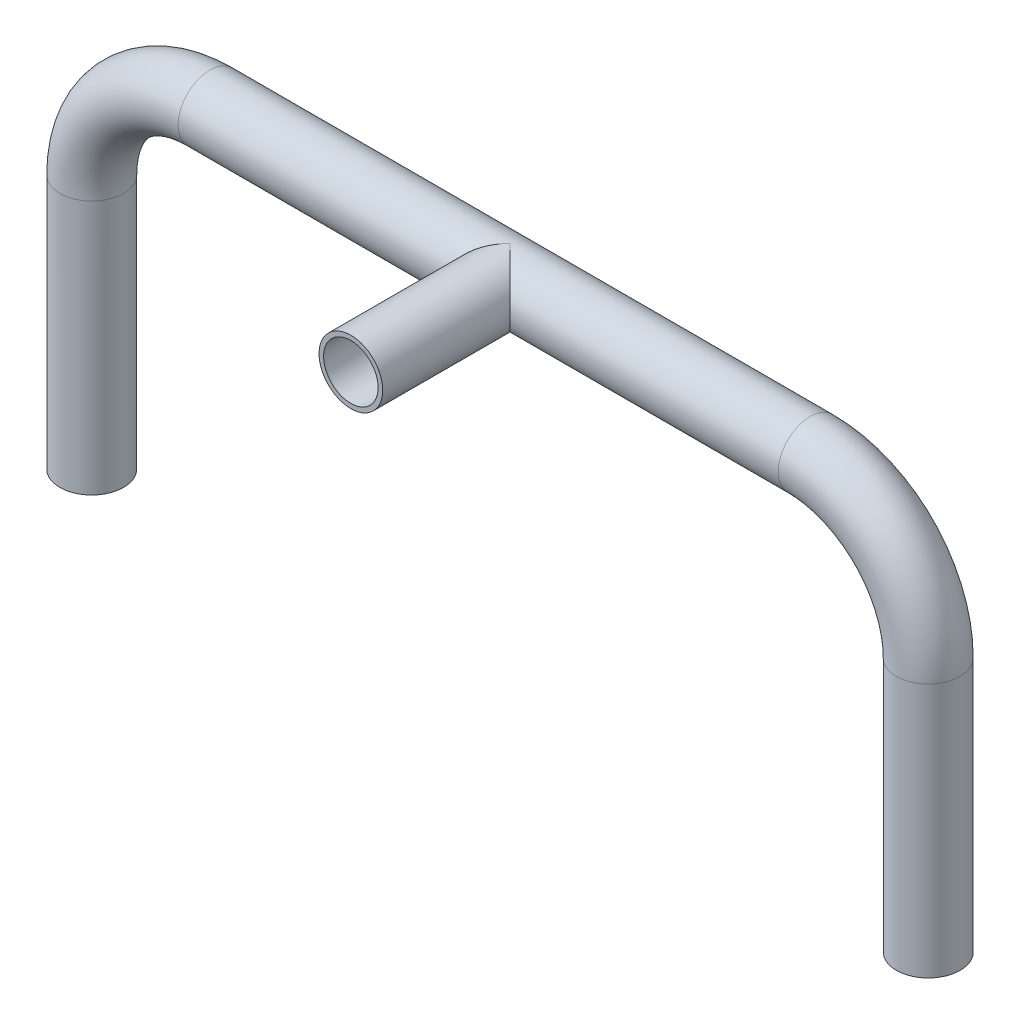
ISO-10303-21;
HEADER;
FILE_DESCRIPTION(('STEP AP214'),'2;1');
FILE_NAME('part.step','',(''),(''),'','','');
FILE_SCHEMA(('AUTOMOTIVE_DESIGN { 1 0 10303 214 1 1 1 1 }'));
ENDSEC;
DATA;
#1=APPLICATION_CONTEXT('core data for automotive mechanical design processes');
#2=APPLICATION_PROTOCOL_DEFINITION('international standard','automotive_design',2000,#1);
#3=PRODUCT_CONTEXT('',#1,'mechanical');
#4=PRODUCT('Part','Part','',(#3));
#5=PRODUCT_RELATED_PRODUCT_CATEGORY('part','',(#4));
#6=PRODUCT_DEFINITION_FORMATION('','',#4);
#7=PRODUCT_DEFINITION_CONTEXT('part definition',#1,'design');
#8=PRODUCT_DEFINITION('design','',#6,#7);
#9=PRODUCT_DEFINITION_SHAPE('','',#8);
#10=(LENGTH_UNIT() NAMED_UNIT(*) SI_UNIT(.MILLI.,.METRE.));
#11=(NAMED_UNIT(*) PLANE_ANGLE_UNIT() SI_UNIT($,.RADIAN.));
#12=(NAMED_UNIT(*) SI_UNIT($,.STERADIAN.) SOLID_ANGLE_UNIT());
#13=UNCERTAINTY_MEASURE_WITH_UNIT(LENGTH_MEASURE(1.E-05),#10,'distance_accuracy_value','');
#14=(GEOMETRIC_REPRESENTATION_CONTEXT(3) GLOBAL_UNCERTAINTY_ASSIGNED_CONTEXT((#13)) GLOBAL_UNIT_ASSIGNED_CONTEXT((#10,
#11,#12)) REPRESENTATION_CONTEXT('',''));
#15=CARTESIAN_POINT('',(0.,0.,0.));
#16=DIRECTION('',(0.,0.,1.));
#17=DIRECTION('',(1.,0.,0.));
#18=AXIS2_PLACEMENT_3D('',#15,#16,#17);
#19=CARTESIAN_POINT('',(-33.,0.,0.));
#20=DIRECTION('',(1.,0.,0.));
#21=DIRECTION('',(0.,0.,-1.));
#22=AXIS2_PLACEMENT_3D('',#19,#20,#21);
#23=CYLINDRICAL_SURFACE('',#22,3.5);
#24=CARTESIAN_POINT('',(-33.,0.,0.));
#25=DIRECTION('',(-1.,0.,0.));
#26=DIRECTION('',(0.,-1.,0.));
#27=AXIS2_PLACEMENT_3D('',#24,#25,#26);
#28=CIRCLE('',#27,3.5);
#29=CARTESIAN_POINT('',(-33.,3.50000000000001,0.));
#30=VERTEX_POINT('',#29);
#31=EDGE_CURVE('E290',#30,#30,#28,.T.);
#32=ORIENTED_EDGE('',*,*,#31,.F.);
#33=EDGE_LOOP('',(#32));
#34=FACE_BOUND('',#33,.T.);
#35=CARTESIAN_POINT('',(33.,0.,0.));
#36=DIRECTION('',(1.,0.,0.));
#37=DIRECTION('',(0.,0.,-1.));
#38=AXIS2_PLACEMENT_3D('',#35,#36,#37);
#39=CIRCLE('',#38,3.5);
#40=CARTESIAN_POINT('',(33.,3.5,0.));
#41=VERTEX_POINT('',#40);
#42=EDGE_CURVE('E293',#41,#41,#39,.F.);
#43=ORIENTED_EDGE('',*,*,#42,.T.);
#44=EDGE_LOOP('',(#43));
#45=FACE_BOUND('',#44,.T.);
#46=CARTESIAN_POINT('',(0.,0.,0.));
#47=DIRECTION('',(0.707106781186547,0.,-0.707106781186547));
#48=DIRECTION('',(0.707106781186547,0.,0.707106781186547));
#49=AXIS2_PLACEMENT_3D('',#46,#47,#48);
#50=ELLIPSE('',#49,4.94974746830583,3.5);
#51=CARTESIAN_POINT('',(0.,-3.5,0.));
#52=VERTEX_POINT('',#51);
#53=CARTESIAN_POINT('',(0.,3.5,0.));
#54=VERTEX_POINT('',#53);
#55=EDGE_CURVE('E270',#52,#54,#50,.F.);
#56=ORIENTED_EDGE('',*,*,#55,.F.);
#57=CARTESIAN_POINT('',(0.,0.,0.));
#58=DIRECTION('',(0.707106781186547,0.,0.707106781186547));
#59=DIRECTION('',(0.707106781186547,0.,-0.707106781186547));
#60=AXIS2_PLACEMENT_3D('',#57,#58,#59);
#61=ELLIPSE('',#60,4.94974746830583,3.5);
#62=EDGE_CURVE('E73',#54,#52,#61,.T.);
#63=ORIENTED_EDGE('',*,*,#62,.F.);
#64=EDGE_LOOP('',(#56,#63));
#65=FACE_BOUND('',#64,.T.);
#66=ADVANCED_FACE('F51',(#34,#45,#65),#23,.T.);
#67=CARTESIAN_POINT('',(-33.,0.,0.));
#68=DIRECTION('',(1.,0.,0.));
#69=DIRECTION('',(0.,0.,-1.));
#70=AXIS2_PLACEMENT_3D('',#67,#68,#69);
#71=CYLINDRICAL_SURFACE('',#70,2.5);
#72=CARTESIAN_POINT('',(33.,0.,0.));
#73=DIRECTION('',(-1.,0.,0.));
#74=DIRECTION('',(0.,0.,1.));
#75=AXIS2_PLACEMENT_3D('',#72,#73,#74);
#76=CIRCLE('',#75,2.5);
#77=CARTESIAN_POINT('',(33.,2.50000000000001,0.));
#78=VERTEX_POINT('',#77);
#79=EDGE_CURVE('E277',#78,#78,#76,.T.);
#80=ORIENTED_EDGE('',*,*,#79,.F.);
#81=EDGE_LOOP('',(#80));
#82=FACE_BOUND('',#81,.T.);
#83=CARTESIAN_POINT('',(-33.,0.,0.));
#84=DIRECTION('',(-1.,0.,0.));
#85=DIRECTION('',(0.,0.,1.));
#86=AXIS2_PLACEMENT_3D('',#83,#84,#85);
#87=CIRCLE('',#86,2.5);
#88=CARTESIAN_POINT('',(-33.,2.50000000000001,0.));
#89=VERTEX_POINT('',#88);
#90=EDGE_CURVE('E272',#89,#89,#87,.T.);
#91=ORIENTED_EDGE('',*,*,#90,.T.);
#92=EDGE_LOOP('',(#91));
#93=FACE_BOUND('',#92,.T.);
#94=DIRECTION('',(1.,0.,0.));
#95=VECTOR('',#94,1.);
#96=CARTESIAN_POINT('',(-33.,-2.5,0.));
#97=LINE('',#96,#95);
#98=CARTESIAN_POINT('',(1.6583123951777,-2.5,0.));
#99=VERTEX_POINT('',#98);
#100=CARTESIAN_POINT('',(2.44948974278318,-2.5,0.));
#101=VERTEX_POINT('',#100);
#102=EDGE_CURVE('E115',#99,#101,#97,.T.);
#103=ORIENTED_EDGE('',*,*,#102,.T.);
#104=CARTESIAN_POINT('',(2.44948974278318,-2.5,0.));
#105=CARTESIAN_POINT('',(2.44944907007493,-2.50001766916298,0.0600526131090836));
#106=CARTESIAN_POINT('',(2.45169710608634,-2.49783705343878,0.120078538718097));
#107=CARTESIAN_POINT('',(2.46045447286871,-2.48922287861778,0.239411831935812));
#108=CARTESIAN_POINT('',(2.46695651852141,-2.48279659017782,0.298720251762426));
#109=CARTESIAN_POINT('',(2.48381067013746,-2.4659309717882,0.415489668269687));
#110=CARTESIAN_POINT('',(2.4941178190541,-2.45553845595176,0.472964045082401));
#111=CARTESIAN_POINT('',(2.51808842320246,-2.43095196214054,0.586380750717431));
#112=CARTESIAN_POINT('',(2.53175316691415,-2.41675652460194,0.642322482203759));
#113=CARTESIAN_POINT('',(2.57674977279544,-2.36902031603926,0.806649858466303));
#114=CARTESIAN_POINT('',(2.61222461544596,-2.33019832933539,0.912408855743075));
#115=CARTESIAN_POINT('',(2.6900487116162,-2.23991081543498,1.11591626245835));
#116=CARTESIAN_POINT('',(2.73242051841456,-2.1884035133721,1.21363675184487));
#117=CARTESIAN_POINT('',(2.82841871138342,-2.06332979756339,1.41755313391703));
#118=CARTESIAN_POINT('',(2.88268691420757,-1.98745241980949,1.52203529336443));
#119=CARTESIAN_POINT('',(2.99093180837159,-1.82051332960056,1.7182419914403));
#120=CARTESIAN_POINT('',(3.04490832329947,-1.72944330314019,1.80995949406843));
#121=CARTESIAN_POINT('',(3.15774584045157,-1.51515925705173,1.99438810896048));
#122=CARTESIAN_POINT('',(3.21577997770527,-1.3891088861523,2.08440081172775));
#123=CARTESIAN_POINT('',(3.29352132961311,-1.18658007367669,2.20184535916877));
#124=CARTESIAN_POINT('',(3.31787937131514,-1.11684416664416,2.23805874980852));
#125=CARTESIAN_POINT('',(3.36279506251625,-0.973272843117625,2.30412254199296));
#126=CARTESIAN_POINT('',(3.38335446180146,-0.89943933460438,2.33397587417549));
#127=CARTESIAN_POINT('',(3.42807218479089,-0.714756756551895,2.39842395424957));
#128=CARTESIAN_POINT('',(3.44980679699365,-0.601967089787534,2.42928530574772));
#129=CARTESIAN_POINT('',(3.48214445038761,-0.371712488694297,2.47499324407442));
#130=CARTESIAN_POINT('',(3.49275678546049,-0.254251543066919,2.48985320210661));
#131=CARTESIAN_POINT('',(3.50195985332979,-0.0176660311068557,2.50274740907398));
#132=CARTESIAN_POINT('',(3.50052501373577,0.101461537941369,2.50074586627733));
#133=CARTESIAN_POINT('',(3.48569885764395,0.337487235790802,2.47994926387458));
#134=CARTESIAN_POINT('',(3.47230430171367,0.454384751792909,2.46114965430978));
#135=CARTESIAN_POINT('',(3.43521868843221,0.679693842686157,2.40853968512004));
#136=CARTESIAN_POINT('',(3.41180417221796,0.788246980526544,2.37513198975248));
#137=CARTESIAN_POINT('',(3.35647173923039,0.997933635349307,2.29493854645672));
#138=CARTESIAN_POINT('',(3.32455215929594,1.09906569620507,2.24815018181375));
#139=CARTESIAN_POINT('',(3.25030690752976,1.30329977157233,2.1369145128044));
#140=CARTESIAN_POINT('',(3.20721772475739,1.40536373678751,2.07107978090016));
#141=CARTESIAN_POINT('',(3.11594100830245,1.59757876713174,1.92671165465687));
#142=CARTESIAN_POINT('',(3.06774837883014,1.68771771930596,1.84816552587169));
#143=CARTESIAN_POINT('',(2.96024186440912,1.87088432223528,1.66421791662331));
#144=CARTESIAN_POINT('',(2.90051509403557,1.96138344425109,1.55653487673368));
#145=CARTESIAN_POINT('',(2.78381372303776,2.12376109306031,1.32644866613006));
#146=CARTESIAN_POINT('',(2.72683980244734,2.195635037833,1.20404188401982));
#147=CARTESIAN_POINT('',(2.63458354593604,2.30497117802467,0.974393734409701));
#148=CARTESIAN_POINT('',(2.5973029424587,2.34653634273485,0.869916995821651));
#149=CARTESIAN_POINT('',(2.53312697280473,2.41567834883303,0.653668202702087));
#150=CARTESIAN_POINT('',(2.50618928953307,2.44331233691497,0.541928110038003));
#151=CARTESIAN_POINT('',(2.47453980812302,2.47526879942077,0.357851902224224));
#152=CARTESIAN_POINT('',(2.46525754353572,2.48447904684907,0.287128025528568));
#153=CARTESIAN_POINT('',(2.45268214722051,2.49687304891357,0.144301856093983));
#154=CARTESIAN_POINT('',(2.44941717898643,2.50002846720513,0.0721946695301675));
#155=CARTESIAN_POINT('',(2.44948974278318,2.5,0.));
#156=B_SPLINE_CURVE_WITH_KNOTS('',3,(#104,#105,#106,#107,#108,#109,#110,#111,#112,#113,#114,
#115,#116,#117,#118,#119,#120,#121,#122,#123,#124,#125,#126,#127,#128,#129,#130,#131,#132,#133,
#134,#135,#136,#137,#138,#139,#140,#141,#142,#143,#144,#145,#146,#147,#148,#149,#150,#151,#152,
#153,#154,#155),.UNSPECIFIED.,.F.,.F.,(4,2,2,2,2,2,2,2,2,2,2,2,2,2,2,2,2,2,2,2,2,2,2,2,2,4),(0.,
0.180033338148606,0.359759168024823,0.537426174398067,0.71516146741717,1.06799013172764,
1.4219966319152,1.84068465468142,2.25960255589019,2.75268038127791,2.99911677559095,
3.24543936821249,3.60060053650129,3.95546469150787,4.31108230244934,4.66679626591251,
5.01326887007376,5.35980927657376,5.74499567351802,6.13057037166115,6.58719647137415,
7.04393480025761,7.39813615393726,7.75087247830245,7.96615901563481,8.18245065080504),.UNSPECIFIED.);
#157=CARTESIAN_POINT('',(2.44948974278318,2.5,0.));
#158=VERTEX_POINT('',#157);
#159=EDGE_CURVE('E110',#101,#158,#156,.T.);
#160=ORIENTED_EDGE('',*,*,#159,.T.);
#161=DIRECTION('',(1.,0.,0.));
#162=VECTOR('',#161,1.);
#163=CARTESIAN_POINT('',(-33.,2.5,0.));
#164=LINE('',#163,#162);
#165=CARTESIAN_POINT('',(1.6583123951777,2.5,0.));
#166=VERTEX_POINT('',#165);
#167=EDGE_CURVE('E103',#158,#166,#164,.F.);
#168=ORIENTED_EDGE('',*,*,#167,.T.);
#169=CARTESIAN_POINT('',(1.6583123951777,-2.5,0.));
#170=CARTESIAN_POINT('',(1.65828023930748,-2.50001053689097,0.0446676190961172));
#171=CARTESIAN_POINT('',(1.6601162772629,-2.4988033626358,0.0893146756582218));
#172=CARTESIAN_POINT('',(1.66727317263236,-2.49403945424107,0.178118808574985));
#173=CARTESIAN_POINT('',(1.67258731179569,-2.49048724961453,0.222276662984987));
#174=CARTESIAN_POINT('',(1.68634898291668,-2.48118723003889,0.309186552805186));
#175=CARTESIAN_POINT('',(1.69474943169533,-2.47547237004126,0.351949707497475));
#176=CARTESIAN_POINT('',(1.71430901873712,-2.46196831278083,0.436516845554949));
#177=CARTESIAN_POINT('',(1.72546968412582,-2.4541779670438,0.478320283905698));
#178=CARTESIAN_POINT('',(1.77222694334976,-2.42094569151119,0.634726425048234));
#179=CARTESIAN_POINT('',(1.81578246635463,-2.38888265367656,0.745590990119837));
#180=CARTESIAN_POINT('',(1.91309058631365,-2.3117030535744,0.958667215286052));
#181=CARTESIAN_POINT('',(1.96692669689499,-2.26647787223489,1.06079733200858));
#182=CARTESIAN_POINT('',(2.06333806009315,-2.17845139252837,1.22908717969094));
#183=CARTESIAN_POINT('',(2.10487744088078,-2.13847839662809,1.2973472734266));
#184=CARTESIAN_POINT('',(2.18877312173695,-2.05253160808426,1.42945216003762));
#185=CARTESIAN_POINT('',(2.23112976012052,-2.00655528279991,1.49329507193548));
#186=CARTESIAN_POINT('',(2.3573792706994,-1.85992335660289,1.67790046606017));
#187=CARTESIAN_POINT('',(2.44073385868859,-1.75032166679402,1.79220223726546));
#188=CARTESIAN_POINT('',(2.5810766365136,-1.53332316028445,1.9785848485795));
#189=CARTESIAN_POINT('',(2.63991085386501,-1.43037180448632,2.05448117836856));
#190=CARTESIAN_POINT('',(2.74774689794262,-1.21029935284124,2.19132333858638));
#191=CARTESIAN_POINT('',(2.79676246687922,-1.09319843428571,2.25229009148164));
#192=CARTESIAN_POINT('',(2.87372981565162,-0.867928883305877,2.3471135832324));
#193=CARTESIAN_POINT('',(2.90385830152503,-0.761717046456606,2.38383517864742));
#194=CARTESIAN_POINT('',(2.95260444248338,-0.542830448073848,2.44298114981978));
#195=CARTESIAN_POINT('',(2.9712291086228,-0.43015966882419,2.46541423403497));
#196=CARTESIAN_POINT('',(2.99549159829453,-0.200906226670692,2.49460149180071));
#197=CARTESIAN_POINT('',(3.00107488681869,-0.0843091977674743,2.50128982658614));
#198=CARTESIAN_POINT('',(2.99858143920542,0.148527340090233,2.49829775944192));
#199=CARTESIAN_POINT('',(2.99050499932994,0.264766856743924,2.48861771252144));
#200=CARTESIAN_POINT('',(2.96241339443721,0.485445759029511,2.45478579221322));
#201=CARTESIAN_POINT('',(2.94323604357123,0.590153469719584,2.43164900062191));
#202=CARTESIAN_POINT('',(2.89501327215416,0.793625750717623,2.37305235039454));
#203=CARTESIAN_POINT('',(2.86596638567855,0.892389435591339,2.3375906611205));
#204=CARTESIAN_POINT('',(2.79690287446883,1.09053416369652,2.25240860554024));
#205=CARTESIAN_POINT('',(2.7561602110168,1.18924473934221,2.20172771983302));
#206=CARTESIAN_POINT('',(2.66744714285834,1.3767800718126,2.08960269254213));
#207=CARTESIAN_POINT('',(2.61947031903863,1.46559592577916,2.02814898391748));
#208=CARTESIAN_POINT('',(2.49448801107939,1.67280362441445,1.86454080960494));
#209=CARTESIAN_POINT('',(2.41452810108692,1.78517382835748,1.75692904106797));
#210=CARTESIAN_POINT('',(2.29203972156859,1.93670155603639,1.58276013263235));
#211=CARTESIAN_POINT('',(2.25072647403067,1.98442714978062,1.5224861962744));
#212=CARTESIAN_POINT('',(2.16828385513607,2.07418686478911,1.39772822879842));
#213=CARTESIAN_POINT('',(2.12715442261523,2.11622304065682,1.33324573004271));
#214=CARTESIAN_POINT('',(2.02736668216148,2.21282190384309,1.16889290959051));
#215=CARTESIAN_POINT('',(1.96949413582953,2.26406445132992,1.06656162182183));
#216=CARTESIAN_POINT('',(1.86215058777702,2.35313154217164,0.852162280933767));
#217=CARTESIAN_POINT('',(1.81265778441366,2.39099119237604,0.740120677710074));
#218=CARTESIAN_POINT('',(1.7431252104005,2.44187928159532,0.54236812349213));
#219=CARTESIAN_POINT('',(1.71871174214238,2.45896760338397,0.459278569532454));
#220=CARTESIAN_POINT('',(1.68136078058062,2.48466533863309,0.289382777852357));
#221=CARTESIAN_POINT('',(1.66838023493806,2.49330657445815,0.20259178487256));
#222=CARTESIAN_POINT('',(1.66098011654761,2.49822814088172,0.0960725270432542));
#223=CARTESIAN_POINT('',(1.65998140373825,2.49889195042314,0.0768814878014975));
#224=CARTESIAN_POINT('',(1.65864846758547,2.49977745262101,0.0384623376736734));
#225=CARTESIAN_POINT('',(1.65831437598636,2.49999905762165,0.0192342201937478));
#226=CARTESIAN_POINT('',(1.6583123951777,2.5,0.));
#227=B_SPLINE_CURVE_WITH_KNOTS('',3,(#169,#170,#171,#172,#173,#174,#175,#176,#177,#178,#179,
#180,#181,#182,#183,#184,#185,#186,#187,#188,#189,#190,#191,#192,#193,#194,#195,#196,#197,#198,
#199,#200,#201,#202,#203,#204,#205,#206,#207,#208,#209,#210,#211,#212,#213,#214,#215,#216,#217,
#218,#219,#220,#221,#222,#223,#224,#225,#226),.UNSPECIFIED.,.F.,.F.,(4,2,2,2,2,2,2,2,2,2,2,2,2,
2,2,2,2,2,2,2,2,2,2,2,2,2,2,2,4),(0.,0.133915809511517,0.267573709534375,0.399271959248702,
0.531043236367035,0.898867426511474,1.26981755381915,1.53753000139769,1.8053557566704,
2.33924592067388,2.76010881123972,3.18037848070633,3.52797653415751,3.87536253284724,
4.22419861170398,4.57302712485181,4.89843954153485,5.22390031294721,5.57721326116425,
5.93084158108767,6.45264424433968,6.71427180911986,6.97580463953597,7.35949670871462,
7.74217465007992,8.00607441227289,8.26897611958204,8.32665105551863,8.38433742291034),.UNSPECIFIED.);
#228=EDGE_CURVE('E104',#99,#166,#227,.T.);
#229=ORIENTED_EDGE('',*,*,#228,.F.);
#230=EDGE_LOOP('',(#103,#160,#168,#229));
#231=FACE_BOUND('',#230,.T.);
#232=CARTESIAN_POINT('',(-1.6583123951777,2.5,0.));
#233=VERTEX_POINT('',#232);
#234=CARTESIAN_POINT('',(-2.44948974278318,2.5,0.));
#235=VERTEX_POINT('',#234);
#236=EDGE_CURVE('E112',#233,#235,#164,.F.);
#237=ORIENTED_EDGE('',*,*,#236,.T.);
#238=CARTESIAN_POINT('',(-2.44948974278318,2.5,0.));
#239=CARTESIAN_POINT('',(-2.44944907007493,2.50001766916298,0.0600526131090836));
#240=CARTESIAN_POINT('',(-2.45169710608634,2.49783705343878,0.120078538718097));
#241=CARTESIAN_POINT('',(-2.46045447286871,2.48922287861778,0.239411831935812));
#242=CARTESIAN_POINT('',(-2.46695651852141,2.48279659017782,0.298720251762426));
#243=CARTESIAN_POINT('',(-2.48381067013746,2.4659309717882,0.415489668269687));
#244=CARTESIAN_POINT('',(-2.4941178190541,2.45553845595176,0.472964045082401));
#245=CARTESIAN_POINT('',(-2.51808842320246,2.43095196214054,0.586380750717431));
#246=CARTESIAN_POINT('',(-2.53175316691415,2.41675652460194,0.642322482203759));
#247=CARTESIAN_POINT('',(-2.57674977279544,2.36902031603926,0.806649858466303));
#248=CARTESIAN_POINT('',(-2.61222461544596,2.33019832933539,0.912408855743075));
#249=CARTESIAN_POINT('',(-2.6900487116162,2.23991081543498,1.11591626245835));
#250=CARTESIAN_POINT('',(-2.73242051841456,2.1884035133721,1.21363675184487));
#251=CARTESIAN_POINT('',(-2.82841871138342,2.06332979756339,1.41755313391703));
#252=CARTESIAN_POINT('',(-2.88268691420757,1.98745241980949,1.52203529336443));
#253=CARTESIAN_POINT('',(-2.99093180837159,1.82051332960056,1.7182419914403));
#254=CARTESIAN_POINT('',(-3.04490832329947,1.72944330314019,1.80995949406843));
#255=CARTESIAN_POINT('',(-3.15774584045157,1.51515925705173,1.99438810896048));
#256=CARTESIAN_POINT('',(-3.21577997770527,1.3891088861523,2.08440081172775));
#257=CARTESIAN_POINT('',(-3.29352132961311,1.18658007367669,2.20184535916877));
#258=CARTESIAN_POINT('',(-3.31787937131514,1.11684416664416,2.23805874980852));
#259=CARTESIAN_POINT('',(-3.36279506251625,0.973272843117625,2.30412254199296));
#260=CARTESIAN_POINT('',(-3.38335446180146,0.89943933460438,2.33397587417549));
#261=CARTESIAN_POINT('',(-3.42807218479089,0.714756756551895,2.39842395424957));
#262=CARTESIAN_POINT('',(-3.44980679699365,0.601967089787534,2.42928530574772));
#263=CARTESIAN_POINT('',(-3.48214445038761,0.371712488694297,2.47499324407442));
#264=CARTESIAN_POINT('',(-3.49275678546049,0.254251543066919,2.48985320210661));
#265=CARTESIAN_POINT('',(-3.50195985332979,0.0176660311068557,2.50274740907398));
#266=CARTESIAN_POINT('',(-3.50052501373577,-0.101461537941369,2.50074586627733));
#267=CARTESIAN_POINT('',(-3.48569885764395,-0.337487235790802,2.47994926387458));
#268=CARTESIAN_POINT('',(-3.47230430171367,-0.454384751792909,2.46114965430978));
#269=CARTESIAN_POINT('',(-3.43521868843221,-0.679693842686157,2.40853968512004));
#270=CARTESIAN_POINT('',(-3.41180417221796,-0.788246980526544,2.37513198975248));
#271=CARTESIAN_POINT('',(-3.35647173923039,-0.997933635349307,2.29493854645672));
#272=CARTESIAN_POINT('',(-3.32455215929594,-1.09906569620507,2.24815018181375));
#273=CARTESIAN_POINT('',(-3.25030690752976,-1.30329977157233,2.1369145128044));
#274=CARTESIAN_POINT('',(-3.20721772475739,-1.40536373678751,2.07107978090016));
#275=CARTESIAN_POINT('',(-3.11594100830245,-1.59757876713174,1.92671165465687));
#276=CARTESIAN_POINT('',(-3.06774837883014,-1.68771771930596,1.84816552587169));
#277=CARTESIAN_POINT('',(-2.96024186440912,-1.87088432223528,1.66421791662331));
#278=CARTESIAN_POINT('',(-2.90051509403557,-1.96138344425109,1.55653487673368));
#279=CARTESIAN_POINT('',(-2.78381372303776,-2.12376109306031,1.32644866613006));
#280=CARTESIAN_POINT('',(-2.72683980244734,-2.195635037833,1.20404188401982));
#281=CARTESIAN_POINT('',(-2.63458354593604,-2.30497117802467,0.974393734409701));
#282=CARTESIAN_POINT('',(-2.5973029424587,-2.34653634273485,0.869916995821651));
#283=CARTESIAN_POINT('',(-2.53312697280473,-2.41567834883303,0.653668202702087));
#284=CARTESIAN_POINT('',(-2.50618928953307,-2.44331233691497,0.541928110038003));
#285=CARTESIAN_POINT('',(-2.47453980812302,-2.47526879942077,0.357851902224224));
#286=CARTESIAN_POINT('',(-2.46525754353572,-2.48447904684907,0.287128025528568));
#287=CARTESIAN_POINT('',(-2.45268214722051,-2.49687304891357,0.144301856093983));
#288=CARTESIAN_POINT('',(-2.44941717898643,-2.50002846720513,0.0721946695301675));
#289=CARTESIAN_POINT('',(-2.44948974278318,-2.5,0.));
#290=B_SPLINE_CURVE_WITH_KNOTS('',3,(#238,#239,#240,#241,#242,#243,#244,#245,#246,#247,#248,
#249,#250,#251,#252,#253,#254,#255,#256,#257,#258,#259,#260,#261,#262,#263,#264,#265,#266,#267,
#268,#269,#270,#271,#272,#273,#274,#275,#276,#277,#278,#279,#280,#281,#282,#283,#284,#285,#286,
#287,#288,#289),.UNSPECIFIED.,.F.,.F.,(4,2,2,2,2,2,2,2,2,2,2,2,2,2,2,2,2,2,2,2,2,2,2,2,2,4),(0.,
0.180033338148606,0.359759168024823,0.537426174398067,0.71516146741717,1.06799013172764,
1.4219966319152,1.84068465468142,2.25960255589019,2.75268038127791,2.99911677559095,
3.24543936821249,3.60060053650129,3.95546469150787,4.31108230244934,4.66679626591251,
5.01326887007376,5.35980927657376,5.74499567351802,6.13057037166115,6.58719647137415,
7.04393480025761,7.39813615393726,7.75087247830245,7.96615901563481,8.18245065080504),.UNSPECIFIED.);
#291=CARTESIAN_POINT('',(-2.44948974278318,-2.5,0.));
#292=VERTEX_POINT('',#291);
#293=EDGE_CURVE('E12',#235,#292,#290,.T.);
#294=ORIENTED_EDGE('',*,*,#293,.T.);
#295=CARTESIAN_POINT('',(-1.6583123951777,-2.5,0.));
#296=VERTEX_POINT('',#295);
#297=EDGE_CURVE('E63',#292,#296,#97,.T.);
#298=ORIENTED_EDGE('',*,*,#297,.T.);
#299=CARTESIAN_POINT('',(-1.6583123951777,2.5,0.));
#300=CARTESIAN_POINT('',(-1.65828023930748,2.50001053689097,0.0446676190961172));
#301=CARTESIAN_POINT('',(-1.6601162772629,2.4988033626358,0.0893146756582218));
#302=CARTESIAN_POINT('',(-1.66727317263236,2.49403945424107,0.178118808574985));
#303=CARTESIAN_POINT('',(-1.67258731179569,2.49048724961453,0.222276662984987));
#304=CARTESIAN_POINT('',(-1.68634898291668,2.48118723003889,0.309186552805186));
#305=CARTESIAN_POINT('',(-1.69474943169533,2.47547237004126,0.351949707497475));
#306=CARTESIAN_POINT('',(-1.71430901873712,2.46196831278083,0.436516845554949));
#307=CARTESIAN_POINT('',(-1.72546968412582,2.4541779670438,0.478320283905698));
#308=CARTESIAN_POINT('',(-1.77222694334976,2.42094569151119,0.634726425048234));
#309=CARTESIAN_POINT('',(-1.81578246635463,2.38888265367656,0.745590990119837));
#310=CARTESIAN_POINT('',(-1.91309058631365,2.3117030535744,0.958667215286052));
#311=CARTESIAN_POINT('',(-1.96692669689499,2.26647787223489,1.06079733200858));
#312=CARTESIAN_POINT('',(-2.06333806009315,2.17845139252837,1.22908717969094));
#313=CARTESIAN_POINT('',(-2.10487744088078,2.13847839662809,1.2973472734266));
#314=CARTESIAN_POINT('',(-2.18877312173695,2.05253160808426,1.42945216003762));
#315=CARTESIAN_POINT('',(-2.23112976012052,2.00655528279991,1.49329507193548));
#316=CARTESIAN_POINT('',(-2.3573792706994,1.85992335660289,1.67790046606017));
#317=CARTESIAN_POINT('',(-2.44073385868859,1.75032166679402,1.79220223726546));
#318=CARTESIAN_POINT('',(-2.5810766365136,1.53332316028445,1.9785848485795));
#319=CARTESIAN_POINT('',(-2.63991085386501,1.43037180448632,2.05448117836856));
#320=CARTESIAN_POINT('',(-2.74774689794262,1.21029935284124,2.19132333858638));
#321=CARTESIAN_POINT('',(-2.79676246687922,1.09319843428571,2.25229009148164));
#322=CARTESIAN_POINT('',(-2.87372981565162,0.867928883305877,2.3471135832324));
#323=CARTESIAN_POINT('',(-2.90385830152503,0.761717046456606,2.38383517864742));
#324=CARTESIAN_POINT('',(-2.95260444248338,0.542830448073848,2.44298114981978));
#325=CARTESIAN_POINT('',(-2.9712291086228,0.43015966882419,2.46541423403497));
#326=CARTESIAN_POINT('',(-2.99549159829453,0.200906226670692,2.49460149180071));
#327=CARTESIAN_POINT('',(-3.00107488681869,0.0843091977674743,2.50128982658614));
#328=CARTESIAN_POINT('',(-2.99858143920542,-0.148527340090233,2.49829775944192));
#329=CARTESIAN_POINT('',(-2.99050499932994,-0.264766856743924,2.48861771252144));
#330=CARTESIAN_POINT('',(-2.96241339443721,-0.485445759029511,2.45478579221322));
#331=CARTESIAN_POINT('',(-2.94323604357123,-0.590153469719584,2.43164900062191));
#332=CARTESIAN_POINT('',(-2.89501327215416,-0.793625750717623,2.37305235039454));
#333=CARTESIAN_POINT('',(-2.86596638567855,-0.892389435591339,2.3375906611205));
#334=CARTESIAN_POINT('',(-2.79690287446883,-1.09053416369652,2.25240860554024));
#335=CARTESIAN_POINT('',(-2.7561602110168,-1.18924473934221,2.20172771983302));
#336=CARTESIAN_POINT('',(-2.66744714285834,-1.3767800718126,2.08960269254213));
#337=CARTESIAN_POINT('',(-2.61947031903863,-1.46559592577916,2.02814898391748));
#338=CARTESIAN_POINT('',(-2.49448801107939,-1.67280362441445,1.86454080960494));
#339=CARTESIAN_POINT('',(-2.41452810108692,-1.78517382835748,1.75692904106797));
#340=CARTESIAN_POINT('',(-2.29203972156859,-1.93670155603639,1.58276013263235));
#341=CARTESIAN_POINT('',(-2.25072647403067,-1.98442714978062,1.5224861962744));
#342=CARTESIAN_POINT('',(-2.16828385513607,-2.07418686478911,1.39772822879842));
#343=CARTESIAN_POINT('',(-2.12715442261523,-2.11622304065682,1.33324573004271));
#344=CARTESIAN_POINT('',(-2.02736668216148,-2.21282190384309,1.16889290959051));
#345=CARTESIAN_POINT('',(-1.96949413582953,-2.26406445132992,1.06656162182183));
#346=CARTESIAN_POINT('',(-1.86215058777702,-2.35313154217164,0.852162280933767));
#347=CARTESIAN_POINT('',(-1.81265778441366,-2.39099119237604,0.740120677710074));
#348=CARTESIAN_POINT('',(-1.7431252104005,-2.44187928159532,0.54236812349213));
#349=CARTESIAN_POINT('',(-1.71871174214238,-2.45896760338397,0.459278569532454));
#350=CARTESIAN_POINT('',(-1.68136078058062,-2.48466533863309,0.289382777852357));
#351=CARTESIAN_POINT('',(-1.66838023493806,-2.49330657445815,0.20259178487256));
#352=CARTESIAN_POINT('',(-1.66098011654761,-2.49822814088172,0.0960725270432542));
#353=CARTESIAN_POINT('',(-1.65998140373825,-2.49889195042314,0.0768814878014975));
#354=CARTESIAN_POINT('',(-1.65864846758547,-2.49977745262101,0.0384623376736734));
#355=CARTESIAN_POINT('',(-1.65831437598636,-2.49999905762165,0.0192342201937478));
#356=CARTESIAN_POINT('',(-1.6583123951777,-2.5,0.));
#357=B_SPLINE_CURVE_WITH_KNOTS('',3,(#299,#300,#301,#302,#303,#304,#305,#306,#307,#308,#309,
#310,#311,#312,#313,#314,#315,#316,#317,#318,#319,#320,#321,#322,#323,#324,#325,#326,#327,#328,
#329,#330,#331,#332,#333,#334,#335,#336,#337,#338,#339,#340,#341,#342,#343,#344,#345,#346,#347,
#348,#349,#350,#351,#352,#353,#354,#355,#356),.UNSPECIFIED.,.F.,.F.,(4,2,2,2,2,2,2,2,2,2,2,2,2,
2,2,2,2,2,2,2,2,2,2,2,2,2,2,2,4),(0.,0.133915809511517,0.267573709534375,0.399271959248702,
0.531043236367035,0.898867426511474,1.26981755381915,1.53753000139769,1.8053557566704,
2.33924592067388,2.76010881123972,3.18037848070633,3.52797653415751,3.87536253284724,
4.22419861170398,4.57302712485181,4.89843954153485,5.22390031294721,5.57721326116425,
5.93084158108767,6.45264424433968,6.71427180911986,6.97580463953597,7.35949670871462,
7.74217465007992,8.00607441227289,8.26897611958204,8.32665105551863,8.38433742291034),.UNSPECIFIED.);
#358=EDGE_CURVE('E163',#233,#296,#357,.T.);
#359=ORIENTED_EDGE('',*,*,#358,.F.);
#360=EDGE_LOOP('',(#237,#294,#298,#359));
#361=FACE_BOUND('',#360,.T.);
#362=ADVANCED_FACE('F101',(#82,#93,#231,#361),#71,.F.);
#363=CARTESIAN_POINT('',(-46.,-41.,0.));
#364=DIRECTION('',(0.,-1.,0.));
#365=DIRECTION('',(0.,0.,1.));
#366=AXIS2_PLACEMENT_3D('',#363,#364,#365);
#367=PLANE('',#366);
#368=CARTESIAN_POINT('',(-46.,-41.,0.));
#369=DIRECTION('',(0.,-1.,0.));
#370=DIRECTION('',(0.,0.,1.));
#371=AXIS2_PLACEMENT_3D('',#368,#369,#370);
#372=CIRCLE('',#371,2.5);
#373=CARTESIAN_POINT('',(-46.,-41.,2.5));
#374=VERTEX_POINT('',#373);
#375=EDGE_CURVE('E267',#374,#374,#372,.T.);
#376=ORIENTED_EDGE('',*,*,#375,.F.);
#377=EDGE_LOOP('',(#376));
#378=FACE_BOUND('',#377,.T.);
#379=CARTESIAN_POINT('',(-46.,-41.,0.));
#380=DIRECTION('',(0.,-1.,0.));
#381=DIRECTION('',(1.,0.,0.));
#382=AXIS2_PLACEMENT_3D('',#379,#380,#381);
#383=CIRCLE('',#382,3.5);
#384=CARTESIAN_POINT('',(-42.5,-41.,0.));
#385=VERTEX_POINT('',#384);
#386=EDGE_CURVE('E284',#385,#385,#383,.T.);
#387=ORIENTED_EDGE('',*,*,#386,.T.);
#388=EDGE_LOOP('',(#387));
#389=FACE_BOUND('',#388,.T.);
#390=ADVANCED_FACE('F180',(#378,#389),#367,.T.);
#391=CARTESIAN_POINT('',(46.,-41.,0.));
#392=DIRECTION('',(0.,1.,0.));
#393=DIRECTION('',(0.,0.,1.));
#394=AXIS2_PLACEMENT_3D('',#391,#392,#393);
#395=PLANE('',#394);
#396=CARTESIAN_POINT('',(46.,-41.,0.));
#397=DIRECTION('',(0.,1.,0.));
#398=DIRECTION('',(0.,0.,1.));
#399=AXIS2_PLACEMENT_3D('',#396,#397,#398);
#400=CIRCLE('',#399,2.5);
#401=CARTESIAN_POINT('',(46.,-41.,2.5));
#402=VERTEX_POINT('',#401);
#403=EDGE_CURVE('E285',#402,#402,#400,.T.);
#404=ORIENTED_EDGE('',*,*,#403,.T.);
#405=EDGE_LOOP('',(#404));
#406=FACE_BOUND('',#405,.T.);
#407=CARTESIAN_POINT('',(46.,-41.,0.));
#408=DIRECTION('',(0.,1.,0.));
#409=DIRECTION('',(0.,0.,1.));
#410=AXIS2_PLACEMENT_3D('',#407,#408,#409);
#411=CIRCLE('',#410,3.5);
#412=CARTESIAN_POINT('',(46.,-41.,3.5));
#413=VERTEX_POINT('',#412);
#414=EDGE_CURVE('E118',#413,#413,#411,.T.);
#415=ORIENTED_EDGE('',*,*,#414,.F.);
#416=EDGE_LOOP('',(#415));
#417=FACE_BOUND('',#416,.T.);
#418=ADVANCED_FACE('F195',(#406,#417),#395,.F.);
#419=CARTESIAN_POINT('',(-46.,-41.,0.));
#420=DIRECTION('',(0.,1.,0.));
#421=DIRECTION('',(-1.,0.,0.));
#422=AXIS2_PLACEMENT_3D('',#419,#420,#421);
#423=CYLINDRICAL_SURFACE('',#422,3.5);
#424=CARTESIAN_POINT('',(-46.,-13.,0.));
#425=DIRECTION('',(0.,1.,0.));
#426=DIRECTION('',(-1.,0.,0.));
#427=AXIS2_PLACEMENT_3D('',#424,#425,#426);
#428=CIRCLE('',#427,3.5);
#429=CARTESIAN_POINT('',(-49.5,-13.,0.));
#430=VERTEX_POINT('',#429);
#431=EDGE_CURVE('E288',#430,#430,#428,.F.);
#432=ORIENTED_EDGE('',*,*,#431,.T.);
#433=EDGE_LOOP('',(#432));
#434=FACE_BOUND('',#433,.T.);
#435=ORIENTED_EDGE('',*,*,#386,.F.);
#436=EDGE_LOOP('',(#435));
#437=FACE_BOUND('',#436,.T.);
#438=ADVANCED_FACE('F193',(#434,#437),#423,.T.);
#439=CARTESIAN_POINT('',(-33.,-13.,0.));
#440=DIRECTION('',(0.,0.,-1.));
#441=DIRECTION('',(-1.,0.,0.));
#442=AXIS2_PLACEMENT_3D('',#439,#440,#441);
#443=TOROIDAL_SURFACE('',#442,13.,3.5);
#444=CARTESIAN_POINT('',(-33.,-13.,0.));
#445=DIRECTION('',(0.,0.,-1.));
#446=DIRECTION('',(-1.,0.,0.));
#447=AXIS2_PLACEMENT_3D('',#444,#445,#446);
#448=CIRCLE('',#447,16.5);
#449=EDGE_CURVE('',#430,#30,#448,.T.);
#450=ORIENTED_EDGE('',*,*,#431,.F.);
#451=ORIENTED_EDGE('',*,*,#31,.T.);
#452=ORIENTED_EDGE('',*,*,#449,.T.);
#453=ORIENTED_EDGE('',*,*,#449,.F.);
#454=EDGE_LOOP('',(#450,#452,#451,#453));
#455=FACE_BOUND('',#454,.T.);
#456=ADVANCED_FACE('F203',(#455),#443,.T.);
#457=CARTESIAN_POINT('',(33.,-13.,0.));
#458=DIRECTION('',(0.,0.,-1.));
#459=DIRECTION('',(-1.,0.,0.));
#460=AXIS2_PLACEMENT_3D('',#457,#458,#459);
#461=TOROIDAL_SURFACE('',#460,13.,3.5);
#462=CARTESIAN_POINT('',(46.,-13.,0.));
#463=DIRECTION('',(0.,1.,0.));
#464=DIRECTION('',(-1.,0.,0.));
#465=AXIS2_PLACEMENT_3D('',#462,#463,#464);
#466=CIRCLE('',#465,3.5);
#467=CARTESIAN_POINT('',(49.5,-13.,0.));
#468=VERTEX_POINT('',#467);
#469=EDGE_CURVE('E295',#468,#468,#466,.T.);
#470=CARTESIAN_POINT('',(33.,-13.,0.));
#471=DIRECTION('',(0.,0.,-1.));
#472=DIRECTION('',(-1.,0.,0.));
#473=AXIS2_PLACEMENT_3D('',#470,#471,#472);
#474=CIRCLE('',#473,16.5);
#475=EDGE_CURVE('',#41,#468,#474,.T.);
#476=ORIENTED_EDGE('',*,*,#42,.F.);
#477=ORIENTED_EDGE('',*,*,#469,.T.);
#478=ORIENTED_EDGE('',*,*,#475,.T.);
#479=ORIENTED_EDGE('',*,*,#475,.F.);
#480=EDGE_LOOP('',(#476,#478,#477,#479));
#481=FACE_BOUND('',#480,.T.);
#482=ADVANCED_FACE('F205',(#481),#461,.T.);
#483=CARTESIAN_POINT('',(46.,-13.,0.));
#484=DIRECTION('',(0.,-1.,0.));
#485=DIRECTION('',(1.,0.,0.));
#486=AXIS2_PLACEMENT_3D('',#483,#484,#485);
#487=CYLINDRICAL_SURFACE('',#486,3.5);
#488=ORIENTED_EDGE('',*,*,#414,.T.);
#489=EDGE_LOOP('',(#488));
#490=FACE_BOUND('',#489,.T.);
#491=ORIENTED_EDGE('',*,*,#469,.F.);
#492=EDGE_LOOP('',(#491));
#493=FACE_BOUND('',#492,.T.);
#494=ADVANCED_FACE('F52',(#490,#493),#487,.T.);
#495=CARTESIAN_POINT('',(-46.,-41.,0.));
#496=DIRECTION('',(0.,1.,0.));
#497=DIRECTION('',(-1.,0.,0.));
#498=AXIS2_PLACEMENT_3D('',#495,#496,#497);
#499=CYLINDRICAL_SURFACE('',#498,2.5);
#500=CARTESIAN_POINT('',(-46.,-13.,0.));
#501=DIRECTION('',(0.,-1.,0.));
#502=DIRECTION('',(0.,0.,1.));
#503=AXIS2_PLACEMENT_3D('',#500,#501,#502);
#504=CIRCLE('',#503,2.5);
#505=CARTESIAN_POINT('',(-48.5,-13.,0.));
#506=VERTEX_POINT('',#505);
#507=EDGE_CURVE('E264',#506,#506,#504,.T.);
#508=ORIENTED_EDGE('',*,*,#507,.F.);
#509=EDGE_LOOP('',(#508));
#510=FACE_BOUND('',#509,.T.);
#511=ORIENTED_EDGE('',*,*,#375,.T.);
#512=EDGE_LOOP('',(#511));
#513=FACE_BOUND('',#512,.T.);
#514=ADVANCED_FACE('F249',(#510,#513),#499,.F.);
#515=CARTESIAN_POINT('',(-33.,-13.,0.));
#516=DIRECTION('',(0.,0.,-1.));
#517=DIRECTION('',(-1.,0.,0.));
#518=AXIS2_PLACEMENT_3D('',#515,#516,#517);
#519=TOROIDAL_SURFACE('',#518,13.,2.5);
#520=CARTESIAN_POINT('',(-33.,-13.,0.));
#521=DIRECTION('',(0.,0.,-1.));
#522=DIRECTION('',(-1.,0.,0.));
#523=AXIS2_PLACEMENT_3D('',#520,#521,#522);
#524=CIRCLE('',#523,15.5);
#525=EDGE_CURVE('',#506,#89,#524,.T.);
#526=ORIENTED_EDGE('',*,*,#507,.T.);
#527=ORIENTED_EDGE('',*,*,#90,.F.);
#528=ORIENTED_EDGE('',*,*,#525,.T.);
#529=ORIENTED_EDGE('',*,*,#525,.F.);
#530=EDGE_LOOP('',(#526,#528,#527,#529));
#531=FACE_BOUND('',#530,.T.);
#532=ADVANCED_FACE('F177',(#531),#519,.F.);
#533=CARTESIAN_POINT('',(33.,-13.,0.));
#534=DIRECTION('',(0.,0.,-1.));
#535=DIRECTION('',(-1.,0.,0.));
#536=AXIS2_PLACEMENT_3D('',#533,#534,#535);
#537=TOROIDAL_SURFACE('',#536,13.,2.5);
#538=CARTESIAN_POINT('',(46.,-13.,0.));
#539=DIRECTION('',(0.,1.,0.));
#540=DIRECTION('',(0.,0.,1.));
#541=AXIS2_PLACEMENT_3D('',#538,#539,#540);
#542=CIRCLE('',#541,2.5);
#543=CARTESIAN_POINT('',(48.5,-13.,0.));
#544=VERTEX_POINT('',#543);
#545=EDGE_CURVE('E276',#544,#544,#542,.T.);
#546=CARTESIAN_POINT('',(33.,-13.,0.));
#547=DIRECTION('',(0.,0.,-1.));
#548=DIRECTION('',(-1.,0.,0.));
#549=AXIS2_PLACEMENT_3D('',#546,#547,#548);
#550=CIRCLE('',#549,15.5);
#551=EDGE_CURVE('',#78,#544,#550,.T.);
#552=ORIENTED_EDGE('',*,*,#79,.T.);
#553=ORIENTED_EDGE('',*,*,#545,.F.);
#554=ORIENTED_EDGE('',*,*,#551,.T.);
#555=ORIENTED_EDGE('',*,*,#551,.F.);
#556=EDGE_LOOP('',(#552,#554,#553,#555));
#557=FACE_BOUND('',#556,.T.);
#558=ADVANCED_FACE('F181',(#557),#537,.F.);
#559=CARTESIAN_POINT('',(46.,-13.,0.));
#560=DIRECTION('',(0.,-1.,0.));
#561=DIRECTION('',(1.,0.,0.));
#562=AXIS2_PLACEMENT_3D('',#559,#560,#561);
#563=CYLINDRICAL_SURFACE('',#562,2.5);
#564=ORIENTED_EDGE('',*,*,#403,.F.);
#565=EDGE_LOOP('',(#564));
#566=FACE_BOUND('',#565,.T.);
#567=ORIENTED_EDGE('',*,*,#545,.T.);
#568=EDGE_LOOP('',(#567));
#569=FACE_BOUND('',#568,.T.);
#570=ADVANCED_FACE('F190',(#566,#569),#563,.F.);
#571=CARTESIAN_POINT('',(0.,0.,17.5));
#572=DIRECTION('',(0.,0.,-1.));
#573=DIRECTION('',(-1.,0.,0.));
#574=AXIS2_PLACEMENT_3D('',#571,#572,#573);
#575=CYLINDRICAL_SURFACE('',#574,3.5);
#576=ORIENTED_EDGE('',*,*,#159,.F.);
#577=CARTESIAN_POINT('',(0.,0.,0.));
#578=DIRECTION('',(0.,0.,1.));
#579=DIRECTION('',(1.,0.,0.));
#580=AXIS2_PLACEMENT_3D('',#577,#578,#579);
#581=CIRCLE('',#580,3.5);
#582=EDGE_CURVE('E133',#101,#158,#581,.T.);
#583=ORIENTED_EDGE('',*,*,#582,.T.);
#584=EDGE_LOOP('',(#576,#583));
#585=FACE_BOUND('',#584,.T.);
#586=ADVANCED_FACE('F146',(#585),#575,.T.);
#587=CARTESIAN_POINT('',(0.,0.,17.5));
#588=DIRECTION('',(0.,0.,-1.));
#589=DIRECTION('',(-1.,0.,0.));
#590=AXIS2_PLACEMENT_3D('',#587,#588,#589);
#591=CYLINDRICAL_SURFACE('',#590,3.);
#592=CARTESIAN_POINT('',(0.,0.,0.));
#593=DIRECTION('',(0.,0.,1.));
#594=DIRECTION('',(1.,0.,0.));
#595=AXIS2_PLACEMENT_3D('',#592,#593,#594);
#596=CIRCLE('',#595,3.);
#597=EDGE_CURVE('E117',#99,#166,#596,.T.);
#598=ORIENTED_EDGE('',*,*,#597,.F.);
#599=ORIENTED_EDGE('',*,*,#228,.T.);
#600=EDGE_LOOP('',(#598,#599));
#601=FACE_BOUND('',#600,.T.);
#602=ADVANCED_FACE('F120',(#601),#591,.F.);
#603=CARTESIAN_POINT('',(0.,0.,0.));
#604=DIRECTION('',(0.,0.,1.));
#605=DIRECTION('',(1.,0.,0.));
#606=AXIS2_PLACEMENT_3D('',#603,#604,#605);
#607=PLANE('',#606);
#608=ORIENTED_EDGE('',*,*,#102,.F.);
#609=ORIENTED_EDGE('',*,*,#597,.T.);
#610=ORIENTED_EDGE('',*,*,#167,.F.);
#611=ORIENTED_EDGE('',*,*,#582,.F.);
#612=EDGE_LOOP('',(#608,#609,#610,#611));
#613=FACE_BOUND('',#612,.T.);
#614=ADVANCED_FACE('F122',(#613),#607,.F.);
#615=EDGE_CURVE('E125',#233,#296,#596,.T.);
#616=ORIENTED_EDGE('',*,*,#615,.F.);
#617=ORIENTED_EDGE('',*,*,#358,.T.);
#618=EDGE_LOOP('',(#616,#617));
#619=FACE_BOUND('',#618,.T.);
#620=ADVANCED_FACE('F151',(#619),#591,.F.);
#621=ORIENTED_EDGE('',*,*,#293,.F.);
#622=EDGE_CURVE('E135',#235,#292,#581,.T.);
#623=ORIENTED_EDGE('',*,*,#622,.T.);
#624=EDGE_LOOP('',(#621,#623));
#625=FACE_BOUND('',#624,.T.);
#626=ADVANCED_FACE('F234',(#625),#575,.T.);
#627=ORIENTED_EDGE('',*,*,#297,.F.);
#628=ORIENTED_EDGE('',*,*,#622,.F.);
#629=ORIENTED_EDGE('',*,*,#236,.F.);
#630=ORIENTED_EDGE('',*,*,#615,.T.);
#631=EDGE_LOOP('',(#627,#628,#629,#630));
#632=FACE_BOUND('',#631,.T.);
#633=ADVANCED_FACE('F235',(#632),#607,.F.);
#634=CARTESIAN_POINT('',(0.,0.,17.5));
#635=DIRECTION('',(0.,0.,1.));
#636=DIRECTION('',(1.,0.,0.));
#637=AXIS2_PLACEMENT_3D('',#634,#635,#636);
#638=CIRCLE('',#637,3.5);
#639=CARTESIAN_POINT('',(3.5,0.,17.5));
#640=VERTEX_POINT('',#639);
#641=EDGE_CURVE('E129',#640,#640,#638,.T.);
#642=ORIENTED_EDGE('',*,*,#641,.F.);
#643=EDGE_LOOP('',(#642));
#644=FACE_BOUND('',#643,.T.);
#645=ORIENTED_EDGE('',*,*,#62,.T.);
#646=ORIENTED_EDGE('',*,*,#55,.T.);
#647=EDGE_LOOP('',(#645,#646));
#648=FACE_BOUND('',#647,.T.);
#649=ADVANCED_FACE('F227',(#644,#648),#575,.T.);
#650=CARTESIAN_POINT('',(0.,0.,17.5));
#651=DIRECTION('',(0.,0.,1.));
#652=DIRECTION('',(1.,0.,0.));
#653=AXIS2_PLACEMENT_3D('',#650,#651,#652);
#654=CIRCLE('',#653,3.);
#655=CARTESIAN_POINT('',(3.,0.,17.5));
#656=VERTEX_POINT('',#655);
#657=EDGE_CURVE('E123',#656,#656,#654,.T.);
#658=ORIENTED_EDGE('',*,*,#657,.T.);
#659=EDGE_LOOP('',(#658));
#660=FACE_BOUND('',#659,.T.);
#661=CARTESIAN_POINT('',(-3.,0.,3.5));
#662=CARTESIAN_POINT('',(-2.99999113956163,-0.141258781035286,3.49999130910387));
#663=CARTESIAN_POINT('',(-2.98994668939084,-0.282589251751372,3.49137113054191));
#664=CARTESIAN_POINT('',(-2.95052047401003,-0.560529951560238,3.45766838083577));
#665=CARTESIAN_POINT('',(-2.9211201609048,-0.697135520694408,3.43257001941758));
#666=CARTESIAN_POINT('',(-2.84522946392484,-0.960939434281923,3.3682231692225));
#667=CARTESIAN_POINT('',(-2.79884498825462,-1.08819033010736,3.32906239806058));
#668=CARTESIAN_POINT('',(-2.69143906720074,-1.33188839062238,3.23928739587591));
#669=CARTESIAN_POINT('',(-2.63041283818204,-1.44833200716646,3.18866942195521));
#670=CARTESIAN_POINT('',(-2.47046434176976,-1.7113293645789,3.05782604227885));
#671=CARTESIAN_POINT('',(-2.36594816855198,-1.85254915882471,2.97365319370495));
#672=CARTESIAN_POINT('',(-2.19503553200501,-2.04677961131142,2.84023349584942));
#673=CARTESIAN_POINT('',(-2.13558769723419,-2.1086859518565,2.79447746084307));
#674=CARTESIAN_POINT('',(-2.01227935800064,-2.22665704484402,2.70141201336526));
#675=CARTESIAN_POINT('',(-1.94842042046863,-2.28272385406158,2.65410315559642));
#676=CARTESIAN_POINT('',(-1.81516014940233,-2.39011944604314,2.55785787037339));
#677=CARTESIAN_POINT('',(-1.74567235634739,-2.44132831162143,2.50890792548446));
#678=CARTESIAN_POINT('',(-1.60233756295799,-2.53771071027439,2.4113736130374));
#679=CARTESIAN_POINT('',(-1.52848914034989,-2.58288225835003,2.36278937064836));
#680=CARTESIAN_POINT('',(-1.37647215590413,-2.66699392037762,2.26741582342249));
#681=CARTESIAN_POINT('',(-1.29831306108213,-2.70594701120339,2.22062293976488));
#682=CARTESIAN_POINT('',(-1.13728752470146,-2.77746887575464,2.13048613923288));
#683=CARTESIAN_POINT('',(-1.05442494980935,-2.81004279840465,2.08713945769671));
#684=CARTESIAN_POINT('',(-0.87874285800103,-2.87000013458205,2.00396303024783));
#685=CARTESIAN_POINT('',(-0.785625601367779,-2.89699062309001,1.96446626708074));
#686=CARTESIAN_POINT('',(-0.593668389410204,-2.94231996950199,1.89590311539943));
#687=CARTESIAN_POINT('',(-0.494840611380593,-2.96067652597341,1.8668154190484));
#688=CARTESIAN_POINT('',(-0.290901648800553,-2.98765180618087,1.8233595589536));
#689=CARTESIAN_POINT('',(-0.185718455092926,-2.99612034984208,1.80921870619525));
#690=CARTESIAN_POINT('',(0.0257583177247946,-3.00174700669977,1.79987912156491));
#691=CARTESIAN_POINT('',(0.13205060045494,-2.99891710949435,1.80466031009032));
#692=CARTESIAN_POINT('',(0.32518728931786,-2.98365526262958,1.82973772660747));
#693=CARTESIAN_POINT('',(0.412512384688788,-2.97276396591858,1.84753964454313));
#694=CARTESIAN_POINT('',(0.5834166640187,-2.94400249618866,1.89303178714811));
#695=CARTESIAN_POINT('',(0.666988966072384,-2.9261200422334,1.920739405185));
#696=CARTESIAN_POINT('',(0.822661246737339,-2.88602191964091,1.98041651660602));
#697=CARTESIAN_POINT('',(0.895125945338361,-2.8643205531426,2.01180311595862));
#698=CARTESIAN_POINT('',(1.03657988839368,-2.81621749950086,2.07861097746975));
#699=CARTESIAN_POINT('',(1.10556635411103,-2.78981212837239,2.11403539399375));
#700=CARTESIAN_POINT('',(1.30786165759966,-2.70389425816222,2.22431797298834));
#701=CARTESIAN_POINT('',(1.43625333951997,-2.63774779682383,2.30307745275703));
#702=CARTESIAN_POINT('',(1.69096893963151,-2.48285890292429,2.46970759584304));
#703=CARTESIAN_POINT('',(1.81628509831024,-2.39272127950026,2.55779985972897));
#704=CARTESIAN_POINT('',(2.05278739800343,-2.19315684133493,2.73084097395905));
#705=CARTESIAN_POINT('',(2.16398941244401,-2.08375203212988,2.81579327801911));
#706=CARTESIAN_POINT('',(2.36529711417863,-1.85142620580551,2.9733709956582));
#707=CARTESIAN_POINT('',(2.45618371935756,-1.72946464376779,3.04640194303822));
#708=CARTESIAN_POINT('',(2.62062366816604,-1.46835131198581,3.18047313488725));
#709=CARTESIAN_POINT('',(2.69419357557527,-1.32921616496827,3.24152482838129));
#710=CARTESIAN_POINT('',(2.80894137941218,-1.06166274876463,3.33756734671002));
#711=CARTESIAN_POINT('',(2.85354579514606,-0.93569450400893,3.37525685785135));
#712=CARTESIAN_POINT('',(2.92600227195827,-0.675771970443548,3.43673080103903));
#713=CARTESIAN_POINT('',(2.95386667497044,-0.541823645406353,3.46052547698769));
#714=CARTESIAN_POINT('',(2.99111379966295,-0.268859663971716,3.49237268362495));
#715=CARTESIAN_POINT('',(3.00041165945909,-0.12982368457631,3.50035293022967));
#716=CARTESIAN_POINT('',(2.9995603605093,0.148147443518685,3.49962308690422));
#717=CARTESIAN_POINT('',(2.98941198215565,0.287082596040696,3.49091366674303));
#718=CARTESIAN_POINT('',(2.95187807657161,0.550275733457334,3.45882924157679));
#719=CARTESIAN_POINT('',(2.92580441845244,0.674864922862682,3.43657079108833));
#720=CARTESIAN_POINT('',(2.85912809529053,0.91716391359946,3.37998583148818));
#721=CARTESIAN_POINT('',(2.81852314100001,1.03487262758578,3.34565742090038));
#722=CARTESIAN_POINT('',(2.72083968085954,1.27067713811892,3.26377033189784));
#723=CARTESIAN_POINT('',(2.6626926536549,1.38803091947573,3.21536478659251));
#724=CARTESIAN_POINT('',(2.53390245300141,1.61120220642349,3.10955424271017));
#725=CARTESIAN_POINT('',(2.4632496356636,1.71701070629884,3.05214230273069));
#726=CARTESIAN_POINT('',(2.27299354795406,1.96701098269317,2.90028557889502));
#727=CARTESIAN_POINT('',(2.14666260664371,2.10368188432626,2.80175643451605));
#728=CARTESIAN_POINT('',(1.94226092934456,2.28824941153561,2.64959047653868));
#729=CARTESIAN_POINT('',(1.87151750214246,2.346442183039,2.59805371297938));
#730=CARTESIAN_POINT('',(1.72517238348111,2.45603862117505,2.49470370610512));
#731=CARTESIAN_POINT('',(1.64957227324451,2.50744448098154,2.44289055776195));
#732=CARTESIAN_POINT('',(1.45111672975083,2.62950329865695,2.3124392041212));
#733=CARTESIAN_POINT('',(1.32484779537009,2.69549720016823,2.23447444602085));
#734=CARTESIAN_POINT('',(1.12608630573789,2.78156506438573,2.12487144022681));
#735=CARTESIAN_POINT('',(1.05833935606432,2.80808206343757,2.08959019581467));
#736=CARTESIAN_POINT('',(0.919465710792964,2.85657036320554,2.02279511001046));
#737=CARTESIAN_POINT('',(0.848341154635097,2.87854449545212,1.99127892709073));
#738=CARTESIAN_POINT('',(0.686334842048291,2.92189068185867,1.92726819188253));
#739=CARTESIAN_POINT('',(0.594573345325303,2.9420451770006,1.89611084681293));
#740=CARTESIAN_POINT('',(0.40648428412096,2.97385575357587,1.84582930378652));
#741=CARTESIAN_POINT('',(0.310169127165165,2.98553365385863,1.82667422938017));
#742=CARTESIAN_POINT('',(0.113929681297485,2.99945928105029,1.80373348283061));
#743=CARTESIAN_POINT('',(0.0139788297886659,3.0016109460188,1.80010438589516));
#744=CARTESIAN_POINT('',(-0.184877498949807,2.99595470126586,1.80949479958618));
#745=CARTESIAN_POINT('',(-0.283781892730561,2.988137326896,1.82253013152158));
#746=CARTESIAN_POINT('',(-0.495841633361828,2.96102594246789,1.8662997172547));
#747=CARTESIAN_POINT('',(-0.608122155943072,2.93982919517641,1.8999327588874));
#748=CARTESIAN_POINT('',(-0.825327147598122,2.88642377276277,1.98011571777393));
#749=CARTESIAN_POINT('',(-0.930223739136686,2.85417580844263,2.02671160765072));
#750=CARTESIAN_POINT('',(-1.11619071565675,2.78608136837268,2.11908086223129));
#751=CARTESIAN_POINT('',(-1.1983606100751,2.75167437962725,2.16375422807862));
#752=CARTESIAN_POINT('',(-1.35802041988981,2.67648516512026,2.25609689863106));
#753=CARTESIAN_POINT('',(-1.43550731797084,2.63569888855358,2.30376809535845));
#754=CARTESIAN_POINT('',(-1.58610746337074,2.54791414854707,2.40050186916704));
#755=CARTESIAN_POINT('',(-1.65921530724491,2.50090823091959,2.44956605942962));
#756=CARTESIAN_POINT('',(-1.80105654518042,2.40077706185995,2.54778136653408));
#757=CARTESIAN_POINT('',(-1.86978971853017,2.34765150205795,2.59693248763342));
#758=CARTESIAN_POINT('',(-2.00602084482865,2.23253520253506,2.69663935530983));
#759=CARTESIAN_POINT('',(-2.07329662204459,2.17023918954812,2.74714735932536));
#760=CARTESIAN_POINT('',(-2.20263230282437,2.03885000284196,2.84602420719018));
#761=CARTESIAN_POINT('',(-2.26469117515032,1.96975549107882,2.89439262721178));
#762=CARTESIAN_POINT('',(-2.38291032223751,1.82495140161359,2.98780081254511));
#763=CARTESIAN_POINT('',(-2.4390852896137,1.74925920994228,3.03284878162619));
#764=CARTESIAN_POINT('',(-2.54499583074043,1.59124006192937,3.11866035138815));
#765=CARTESIAN_POINT('',(-2.59473219412649,1.50891392119366,3.15942447732733));
#766=CARTESIAN_POINT('',(-2.70451902315842,1.30521104935005,3.25009676005291));
#767=CARTESIAN_POINT('',(-2.76127357773312,1.18091157257155,3.29756681973379));
#768=CARTESIAN_POINT('',(-2.85815076270752,0.921960340692788,3.37910375169491));
#769=CARTESIAN_POINT('',(-2.89830018990598,0.787325683821174,3.41319221419212));
#770=CARTESIAN_POINT('',(-2.95227694626475,0.54379220896308,3.45916078856193));
#771=CARTESIAN_POINT('',(-2.97009607989053,0.436401801712327,3.47439671694949));
#772=CARTESIAN_POINT('',(-2.99396146751718,0.219355448722341,3.49482005603175));
#773=CARTESIAN_POINT('',(-3.00000688087671,0.10969934177746,3.50000674921289));
#774=CARTESIAN_POINT('',(-3.,0.,3.5));
#775=B_SPLINE_CURVE_WITH_KNOTS('',3,(#661,#662,#663,#664,#665,#666,#667,#668,#669,#670,#671,
#672,#673,#674,#675,#676,#677,#678,#679,#680,#681,#682,#683,#684,#685,#686,#687,#688,#689,#690,
#691,#692,#693,#694,#695,#696,#697,#698,#699,#700,#701,#702,#703,#704,#705,#706,#707,#708,#709,
#710,#711,#712,#713,#714,#715,#716,#717,#718,#719,#720,#721,#722,#723,#724,#725,#726,#727,#728,
#729,#730,#731,#732,#733,#734,#735,#736,#737,#738,#739,#740,#741,#742,#743,#744,#745,#746,#747,
#748,#749,#750,#751,#752,#753,#754,#755,#756,#757,#758,#759,#760,#761,#762,#763,#764,#765,#766,
#767,#768,#769,#770,#771,#772,#773,#774),.UNSPECIFIED.,.T.,.F.,(4,2,2,2,2,2,2,2,2,2,2,2,2,2,2,2,
2,2,2,2,2,2,2,2,2,2,2,2,2,2,2,2,2,2,2,2,2,2,2,2,2,2,2,2,2,2,2,2,2,2,2,2,2,2,2,2,4),(0.,
0.423309126325849,0.847024483250247,1.26814146228373,1.68939621304635,2.27044844138264,
2.56203263776922,2.8535137838025,3.15093818611372,3.44846013876324,3.74535285941904,
4.04200494738726,4.35527306569296,4.66789619114556,4.98520812743368,5.30218343047174,
5.5705012338567,5.83929250792486,6.08462821448602,6.33015690949162,6.82205523451246,
7.35375197279976,7.88484533930119,8.38916440623004,8.8929991031945,9.30781282163291,
9.7223203332275,10.1387181321738,10.5550992211108,10.9410961346832,11.3271538846628,
11.7445046638588,12.162178698162,12.7902930986865,13.1053612190683,13.4203272754534,
13.9059167611535,14.1482663540177,14.3904644339611,14.686452100786,14.9816751639313,
15.279868554455,15.5783452619378,15.9336864396465,16.2903042595147,16.5888911496263,
16.8876684159845,17.1868070638788,17.4859607920207,17.7996457943347,18.1133926584063,
18.4263363915465,18.7392417085845,19.1714297606174,19.6029176147117,19.9316293377679,
20.2603645299167),.UNSPECIFIED.);
#776=CARTESIAN_POINT('',(-3.,0.,3.5));
#777=VERTEX_POINT('',#776);
#778=EDGE_CURVE('E131',#777,#777,#775,.T.);
#779=ORIENTED_EDGE('',*,*,#778,.F.);
#780=EDGE_LOOP('',(#779));
#781=FACE_BOUND('',#780,.T.);
#782=ADVANCED_FACE('F148',(#660,#781),#591,.F.);
#783=CARTESIAN_POINT('',(0.,0.,17.5));
#784=DIRECTION('',(0.,0.,1.));
#785=DIRECTION('',(1.,0.,0.));
#786=AXIS2_PLACEMENT_3D('',#783,#784,#785);
#787=PLANE('',#786);
#788=ORIENTED_EDGE('',*,*,#641,.T.);
#789=EDGE_LOOP('',(#788));
#790=FACE_BOUND('',#789,.T.);
#791=ORIENTED_EDGE('',*,*,#657,.F.);
#792=EDGE_LOOP('',(#791));
#793=FACE_BOUND('',#792,.T.);
#794=ADVANCED_FACE('F155',(#790,#793),#787,.T.);
#795=ORIENTED_EDGE('',*,*,#778,.T.);
#796=EDGE_LOOP('',(#795));
#797=FACE_BOUND('',#796,.T.);
#798=ADVANCED_FACE('F141',(#797),#23,.T.);
#799=CLOSED_SHELL('',(#66,#362,#390,#418,#438,#456,#482,#494,#514,#532,#558,#570,#586,#602,#614,
#620,#626,#633,#649,#782,#794,#798));
#800=MANIFOLD_SOLID_BREP('B2',#799);
#801=ADVANCED_BREP_SHAPE_REPRESENTATION('',(#18,#800),#14);
#802=SHAPE_DEFINITION_REPRESENTATION(#9,#801);
ENDSEC;
END-ISO-10303-21;
